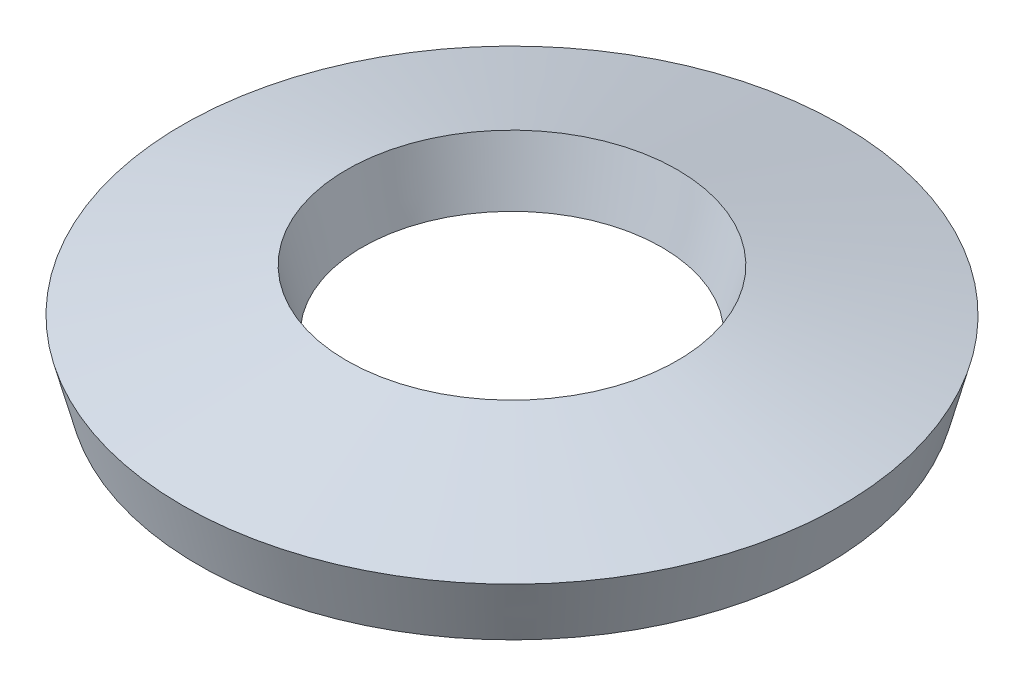
ISO-10303-21;
HEADER;
FILE_DESCRIPTION(('STEP AP214'),'2;1');
FILE_NAME('part.step','',(''),(''),'','','');
FILE_SCHEMA(('AUTOMOTIVE_DESIGN { 1 0 10303 214 1 1 1 1 }'));
ENDSEC;
DATA;
#1=APPLICATION_CONTEXT('core data for automotive mechanical design processes');
#2=APPLICATION_PROTOCOL_DEFINITION('international standard','automotive_design',2000,#1);
#3=PRODUCT_CONTEXT('',#1,'mechanical');
#4=PRODUCT('Part','Part','',(#3));
#5=PRODUCT_RELATED_PRODUCT_CATEGORY('part','',(#4));
#6=PRODUCT_DEFINITION_FORMATION('','',#4);
#7=PRODUCT_DEFINITION_CONTEXT('part definition',#1,'design');
#8=PRODUCT_DEFINITION('design','',#6,#7);
#9=PRODUCT_DEFINITION_SHAPE('','',#8);
#10=(LENGTH_UNIT() NAMED_UNIT(*) SI_UNIT(.MILLI.,.METRE.));
#11=(NAMED_UNIT(*) PLANE_ANGLE_UNIT() SI_UNIT($,.RADIAN.));
#12=(NAMED_UNIT(*) SI_UNIT($,.STERADIAN.) SOLID_ANGLE_UNIT());
#13=UNCERTAINTY_MEASURE_WITH_UNIT(LENGTH_MEASURE(1.E-05),#10,'distance_accuracy_value','');
#14=(GEOMETRIC_REPRESENTATION_CONTEXT(3) GLOBAL_UNCERTAINTY_ASSIGNED_CONTEXT((#13)) GLOBAL_UNIT_ASSIGNED_CONTEXT((#10,
#11,#12)) REPRESENTATION_CONTEXT('',''));
#15=CARTESIAN_POINT('',(0.,0.,0.));
#16=DIRECTION('',(0.,0.,1.));
#17=DIRECTION('',(1.,0.,0.));
#18=AXIS2_PLACEMENT_3D('',#15,#16,#17);
#19=CARTESIAN_POINT('',(0.,0.,0.));
#20=DIRECTION('',(0.,1.,0.));
#21=DIRECTION('',(0.,0.,1.));
#22=AXIS2_PLACEMENT_3D('',#19,#20,#21);
#23=CONICAL_SURFACE('',#22,6.76250709682107,0.257839014382559);
#24=CARTESIAN_POINT('',(0.,1.27713866920093,0.));
#25=DIRECTION('',(0.,-1.,0.));
#26=DIRECTION('',(0.,0.,-1.));
#27=AXIS2_PLACEMENT_3D('',#24,#25,#26);
#28=CIRCLE('',#27,7.0993);
#29=CARTESIAN_POINT('',(0.,1.27713866920093,-7.0993));
#30=VERTEX_POINT('',#29);
#31=EDGE_CURVE('E53',#30,#30,#28,.T.);
#32=ORIENTED_EDGE('',*,*,#31,.T.);
#33=EDGE_LOOP('',(#32));
#34=FACE_BOUND('',#33,.T.);
#35=CARTESIAN_POINT('',(0.,0.,0.));
#36=DIRECTION('',(0.,-1.,0.));
#37=DIRECTION('',(0.,0.,-1.));
#38=AXIS2_PLACEMENT_3D('',#35,#36,#37);
#39=CIRCLE('',#38,6.76250709682107);
#40=CARTESIAN_POINT('',(0.,0.,-6.76250709682107));
#41=VERTEX_POINT('',#40);
#42=EDGE_CURVE('E10',#41,#41,#39,.T.);
#43=ORIENTED_EDGE('',*,*,#42,.F.);
#44=EDGE_LOOP('',(#43));
#45=FACE_BOUND('',#44,.T.);
#46=ADVANCED_FACE('F39',(#34,#45),#23,.T.);
#47=CARTESIAN_POINT('',(0.,0.932661330799073,0.));
#48=DIRECTION('',(0.,-1.,0.));
#49=DIRECTION('',(0.,0.,-1.));
#50=AXIS2_PLACEMENT_3D('',#47,#48,#49);
#51=CONICAL_SURFACE('',#50,3.2258,1.31295731241234);
#52=ORIENTED_EDGE('',*,*,#42,.T.);
#53=EDGE_LOOP('',(#52));
#54=FACE_BOUND('',#53,.T.);
#55=CARTESIAN_POINT('',(0.,0.932661330799073,0.));
#56=DIRECTION('',(0.,-1.,0.));
#57=DIRECTION('',(0.,0.,-1.));
#58=AXIS2_PLACEMENT_3D('',#55,#56,#57);
#59=CIRCLE('',#58,3.2258);
#60=CARTESIAN_POINT('',(0.,0.932661330799073,-3.2258));
#61=VERTEX_POINT('',#60);
#62=EDGE_CURVE('E45',#61,#61,#59,.T.);
#63=ORIENTED_EDGE('',*,*,#62,.F.);
#64=EDGE_LOOP('',(#63));
#65=FACE_BOUND('',#64,.T.);
#66=ADVANCED_FACE('F69',(#54,#65),#51,.F.);
#67=CARTESIAN_POINT('',(0.,2.2098,0.));
#68=DIRECTION('',(0.,1.,0.));
#69=DIRECTION('',(0.,0.,1.));
#70=AXIS2_PLACEMENT_3D('',#67,#68,#69);
#71=CONICAL_SURFACE('',#70,3.56259290317893,0.257839014382559);
#72=ORIENTED_EDGE('',*,*,#62,.T.);
#73=EDGE_LOOP('',(#72));
#74=FACE_BOUND('',#73,.T.);
#75=CARTESIAN_POINT('',(0.,2.2098,0.));
#76=DIRECTION('',(0.,-1.,0.));
#77=DIRECTION('',(0.,0.,-1.));
#78=AXIS2_PLACEMENT_3D('',#75,#76,#77);
#79=CIRCLE('',#78,3.56259290317893);
#80=CARTESIAN_POINT('',(0.,2.2098,-3.56259290317893));
#81=VERTEX_POINT('',#80);
#82=EDGE_CURVE('E49',#81,#81,#79,.T.);
#83=ORIENTED_EDGE('',*,*,#82,.F.);
#84=EDGE_LOOP('',(#83));
#85=FACE_BOUND('',#84,.T.);
#86=ADVANCED_FACE('F63',(#74,#85),#71,.F.);
#87=CARTESIAN_POINT('',(0.,1.27713866920093,0.));
#88=DIRECTION('',(0.,-1.,0.));
#89=DIRECTION('',(0.,0.,-1.));
#90=AXIS2_PLACEMENT_3D('',#87,#88,#89);
#91=CONICAL_SURFACE('',#90,7.0993,1.31295731241234);
#92=ORIENTED_EDGE('',*,*,#82,.T.);
#93=EDGE_LOOP('',(#92));
#94=FACE_BOUND('',#93,.T.);
#95=ORIENTED_EDGE('',*,*,#31,.F.);
#96=EDGE_LOOP('',(#95));
#97=FACE_BOUND('',#96,.T.);
#98=ADVANCED_FACE('F61',(#94,#97),#91,.T.);
#99=CLOSED_SHELL('',(#46,#66,#86,#98));
#100=MANIFOLD_SOLID_BREP('B2',#99);
#101=ADVANCED_BREP_SHAPE_REPRESENTATION('',(#18,#100),#14);
#102=SHAPE_DEFINITION_REPRESENTATION(#9,#101);
ENDSEC;
END-ISO-10303-21;
